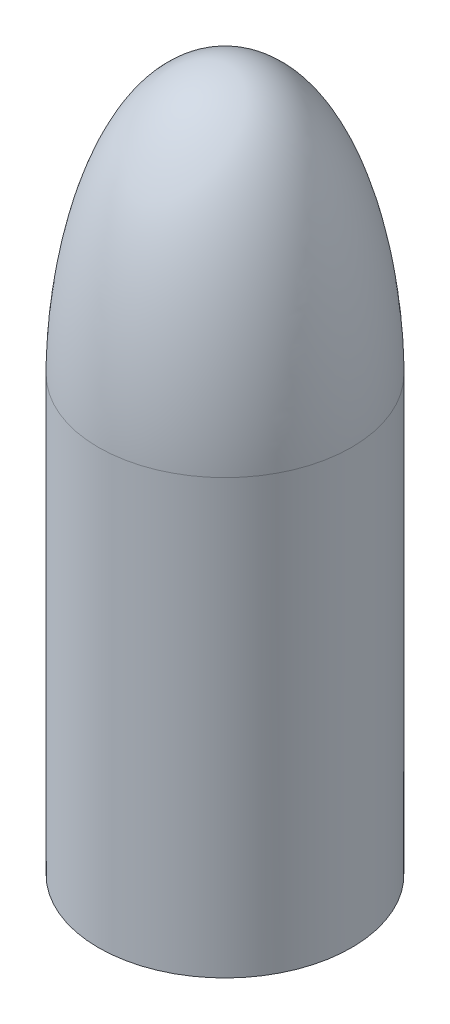
ISO-10303-21;
HEADER;
FILE_DESCRIPTION(('STEP AP214'),'2;1');
FILE_NAME('part.step','',(''),(''),'','','');
FILE_SCHEMA(('AUTOMOTIVE_DESIGN { 1 0 10303 214 1 1 1 1 }'));
ENDSEC;
DATA;
#1=APPLICATION_CONTEXT('core data for automotive mechanical design processes');
#2=APPLICATION_PROTOCOL_DEFINITION('international standard','automotive_design',2000,#1);
#3=PRODUCT_CONTEXT('',#1,'mechanical');
#4=PRODUCT('Part','Part','',(#3));
#5=PRODUCT_RELATED_PRODUCT_CATEGORY('part','',(#4));
#6=PRODUCT_DEFINITION_FORMATION('','',#4);
#7=PRODUCT_DEFINITION_CONTEXT('part definition',#1,'design');
#8=PRODUCT_DEFINITION('design','',#6,#7);
#9=PRODUCT_DEFINITION_SHAPE('','',#8);
#10=(LENGTH_UNIT() NAMED_UNIT(*) SI_UNIT(.MILLI.,.METRE.));
#11=(NAMED_UNIT(*) PLANE_ANGLE_UNIT() SI_UNIT($,.RADIAN.));
#12=(NAMED_UNIT(*) SI_UNIT($,.STERADIAN.) SOLID_ANGLE_UNIT());
#13=UNCERTAINTY_MEASURE_WITH_UNIT(LENGTH_MEASURE(1.E-05),#10,'distance_accuracy_value','');
#14=(GEOMETRIC_REPRESENTATION_CONTEXT(3) GLOBAL_UNCERTAINTY_ASSIGNED_CONTEXT((#13)) GLOBAL_UNIT_ASSIGNED_CONTEXT((#10,
#11,#12)) REPRESENTATION_CONTEXT('',''));
#15=CARTESIAN_POINT('',(0.,0.,0.));
#16=DIRECTION('',(0.,0.,1.));
#17=DIRECTION('',(1.,0.,0.));
#18=AXIS2_PLACEMENT_3D('',#15,#16,#17);
#19=CARTESIAN_POINT('',(0.,0.,0.));
#20=DIRECTION('',(0.,1.,0.));
#21=DIRECTION('',(0.,0.,1.));
#22=AXIS2_PLACEMENT_3D('',#19,#20,#21);
#23=PLANE('',#22);
#24=CARTESIAN_POINT('',(0.,0.,0.));
#25=DIRECTION('',(0.,1.,0.));
#26=DIRECTION('',(0.,0.,1.));
#27=AXIS2_PLACEMENT_3D('',#24,#25,#26);
#28=CIRCLE('',#27,36.5);
#29=CARTESIAN_POINT('',(0.,0.,36.5));
#30=VERTEX_POINT('',#29);
#31=EDGE_CURVE('E40',#30,#30,#28,.T.);
#32=ORIENTED_EDGE('',*,*,#31,.F.);
#33=EDGE_LOOP('',(#32));
#34=FACE_BOUND('',#33,.T.);
#35=CARTESIAN_POINT('',(0.,0.,0.));
#36=DIRECTION('',(0.,1.,0.));
#37=DIRECTION('',(0.,0.,1.));
#38=AXIS2_PLACEMENT_3D('',#35,#36,#37);
#39=CIRCLE('',#38,35.);
#40=CARTESIAN_POINT('',(0.,0.,35.));
#41=VERTEX_POINT('',#40);
#42=EDGE_CURVE('E60',#41,#41,#39,.T.);
#43=ORIENTED_EDGE('',*,*,#42,.T.);
#44=EDGE_LOOP('',(#43));
#45=FACE_BOUND('',#44,.T.);
#46=ADVANCED_FACE('F36',(#34,#45),#23,.F.);
#47=CARTESIAN_POINT('',(0.,125.,0.));
#48=DIRECTION('',(0.,-1.,0.));
#49=DIRECTION('',(0.,0.,-1.));
#50=AXIS2_PLACEMENT_3D('',#47,#48,#49);
#51=CYLINDRICAL_SURFACE('',#50,36.5);
#52=CARTESIAN_POINT('',(0.,125.,0.));
#53=DIRECTION('',(0.,1.,0.));
#54=DIRECTION('',(0.,0.,1.));
#55=AXIS2_PLACEMENT_3D('',#52,#53,#54);
#56=CIRCLE('',#55,36.5);
#57=CARTESIAN_POINT('',(0.,125.,36.5));
#58=VERTEX_POINT('',#57);
#59=EDGE_CURVE('E11',#58,#58,#56,.T.);
#60=ORIENTED_EDGE('',*,*,#59,.F.);
#61=EDGE_LOOP('',(#60));
#62=FACE_BOUND('',#61,.T.);
#63=ORIENTED_EDGE('',*,*,#31,.T.);
#64=EDGE_LOOP('',(#63));
#65=FACE_BOUND('',#64,.T.);
#66=ADVANCED_FACE('F38',(#62,#65),#51,.T.);
#67=CARTESIAN_POINT('',(0.,125.,0.));
#68=DIRECTION('',(0.,-1.,0.));
#69=DIRECTION('',(0.,0.,-1.));
#70=AXIS2_PLACEMENT_3D('',#67,#68,#69);
#71=CYLINDRICAL_SURFACE('',#70,35.);
#72=CARTESIAN_POINT('',(0.,125.,0.));
#73=DIRECTION('',(0.,-1.,0.));
#74=DIRECTION('',(0.,0.,-1.));
#75=AXIS2_PLACEMENT_3D('',#72,#73,#74);
#76=CIRCLE('',#75,35.);
#77=CARTESIAN_POINT('',(0.,125.,-35.));
#78=VERTEX_POINT('',#77);
#79=EDGE_CURVE('E58',#78,#78,#76,.T.);
#80=ORIENTED_EDGE('',*,*,#79,.F.);
#81=EDGE_LOOP('',(#80));
#82=FACE_BOUND('',#81,.T.);
#83=ORIENTED_EDGE('',*,*,#42,.F.);
#84=EDGE_LOOP('',(#83));
#85=FACE_BOUND('',#84,.T.);
#86=ADVANCED_FACE('F54',(#82,#85),#71,.F.);
#87=CARTESIAN_POINT('',(-35.,125.,0.));
#88=CARTESIAN_POINT('',(-35.,156.192184686635,0.));
#89=CARTESIAN_POINT('',(-24.5408302933189,200.789236321107,0.));
#90=CARTESIAN_POINT('',(0.,200.789236321107,0.));
#91=B_SPLINE_CURVE_WITH_KNOTS('',3,(#87,#88,#89,#90),.UNSPECIFIED.,.F.,.F.,(4,4),(0.,1.),.UNSPECIFIED.);
#92=CARTESIAN_POINT('',(0.,125.,0.));
#93=DIRECTION('',(0.,-1.,0.));
#94=AXIS1_PLACEMENT('',#92,#93);
#95=SURFACE_OF_REVOLUTION('',#91,#94);
#96=CARTESIAN_POINT('',(0.,200.789236321107,0.));
#97=VERTEX_POINT('',#96);
#98=VERTEX_LOOP('',#97);
#99=FACE_BOUND('',#98,.T.);
#100=ORIENTED_EDGE('',*,*,#79,.T.);
#101=EDGE_LOOP('',(#100));
#102=FACE_BOUND('',#101,.T.);
#103=ADVANCED_FACE('F50',(#99,#102),#95,.T.);
#104=CARTESIAN_POINT('',(0.,202.289236321107,0.));
#105=CARTESIAN_POINT('',(-0.811820942678196,202.289236321107,0.));
#106=CARTESIAN_POINT('',(-2.45071013605769,202.195610050118,0.));
#107=CARTESIAN_POINT('',(-5.57485501641651,201.647181738241,0.));
#108=CARTESIAN_POINT('',(-9.27116146585073,200.314127167164,0.));
#109=CARTESIAN_POINT('',(-13.3124805345805,197.796637624152,0.));
#110=CARTESIAN_POINT('',(-18.1898469100874,193.376473421857,0.));
#111=CARTESIAN_POINT('',(-23.3759696645802,186.122826781505,0.));
#112=CARTESIAN_POINT('',(-28.3053618046851,175.356614503401,0.));
#113=CARTESIAN_POINT('',(-32.0391646503782,163.180214919718,0.));
#114=CARTESIAN_POINT('',(-34.2092206555489,152.406457609218,0.));
#115=CARTESIAN_POINT('',(-35.4065130323644,143.743673364302,0.));
#116=CARTESIAN_POINT('',(-36.040929773423,137.305804836619,0.));
#117=CARTESIAN_POINT('',(-36.3546769489732,132.066342851695,0.));
#118=CARTESIAN_POINT('',(-36.4793534874133,127.97585131341,0.));
#119=CARTESIAN_POINT('',(-36.5,125.997585893149,0.));
#120=CARTESIAN_POINT('',(-36.5,125.,0.));
#121=B_SPLINE_CURVE_WITH_KNOTS('',3,(#104,#105,#106,#107,#108,#109,#110,#111,#112,#113,#114,
#115,#116,#117,#118,#119,#120),.UNSPECIFIED.,.F.,.F.,(4,1,1,1,1,1,1,1,1,1,1,1,1,1,4),(0.,
0.03125,0.0625,0.125,0.1875,0.25,0.375,0.5,0.625,0.75,0.8125,0.875,0.9375,0.96875,1.),.UNSPECIFIED.);
#122=CARTESIAN_POINT('',(0.,125.,0.));
#123=DIRECTION('',(0.,-1.,0.));
#124=AXIS1_PLACEMENT('',#122,#123);
#125=SURFACE_OF_REVOLUTION('',#121,#124);
#126=ORIENTED_EDGE('',*,*,#59,.T.);
#127=EDGE_LOOP('',(#126));
#128=FACE_BOUND('',#127,.T.);
#129=CARTESIAN_POINT('',(0.,202.289236321107,0.));
#130=VERTEX_POINT('',#129);
#131=VERTEX_LOOP('',#130);
#132=FACE_BOUND('',#131,.T.);
#133=ADVANCED_FACE('F53',(#128,#132),#125,.T.);
#134=CLOSED_SHELL('',(#46,#66,#86,#103,#133));
#135=MANIFOLD_SOLID_BREP('B2',#134);
#136=ADVANCED_BREP_SHAPE_REPRESENTATION('',(#18,#135),#14);
#137=SHAPE_DEFINITION_REPRESENTATION(#9,#136);
ENDSEC;
END-ISO-10303-21;
